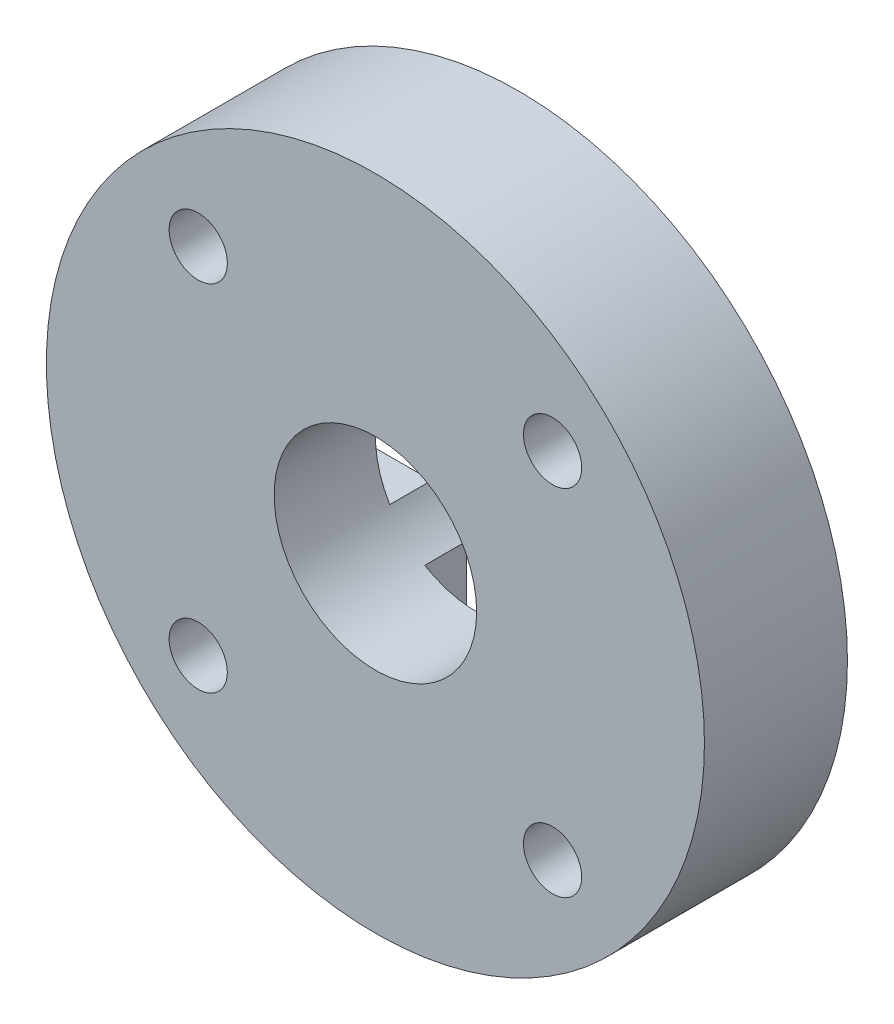
ISO-10303-21;
HEADER;
FILE_DESCRIPTION(('STEP AP214'),'2;1');
FILE_NAME('part.step','',(''),(''),'','','');
FILE_SCHEMA(('AUTOMOTIVE_DESIGN { 1 0 10303 214 1 1 1 1 }'));
ENDSEC;
DATA;
#1=APPLICATION_CONTEXT('core data for automotive mechanical design processes');
#2=APPLICATION_PROTOCOL_DEFINITION('international standard','automotive_design',2000,#1);
#3=PRODUCT_CONTEXT('',#1,'mechanical');
#4=PRODUCT('Part','Part','',(#3));
#5=PRODUCT_RELATED_PRODUCT_CATEGORY('part','',(#4));
#6=PRODUCT_DEFINITION_FORMATION('','',#4);
#7=PRODUCT_DEFINITION_CONTEXT('part definition',#1,'design');
#8=PRODUCT_DEFINITION('design','',#6,#7);
#9=PRODUCT_DEFINITION_SHAPE('','',#8);
#10=(LENGTH_UNIT() NAMED_UNIT(*) SI_UNIT(.MILLI.,.METRE.));
#11=(NAMED_UNIT(*) PLANE_ANGLE_UNIT() SI_UNIT($,.RADIAN.));
#12=(NAMED_UNIT(*) SI_UNIT($,.STERADIAN.) SOLID_ANGLE_UNIT());
#13=UNCERTAINTY_MEASURE_WITH_UNIT(LENGTH_MEASURE(1.E-05),#10,'distance_accuracy_value','');
#14=(GEOMETRIC_REPRESENTATION_CONTEXT(3) GLOBAL_UNCERTAINTY_ASSIGNED_CONTEXT((#13)) GLOBAL_UNIT_ASSIGNED_CONTEXT((#10,
#11,#12)) REPRESENTATION_CONTEXT('',''));
#15=CARTESIAN_POINT('',(0.,0.,0.));
#16=DIRECTION('',(0.,0.,1.));
#17=DIRECTION('',(1.,0.,0.));
#18=AXIS2_PLACEMENT_3D('',#15,#16,#17);
#19=CARTESIAN_POINT('',(0.,0.,-1.65));
#20=DIRECTION('',(0.,0.,1.));
#21=DIRECTION('',(1.,0.,0.));
#22=AXIS2_PLACEMENT_3D('',#19,#20,#21);
#23=PLANE('',#22);
#24=CARTESIAN_POINT('',(7.,-7.,-1.65));
#25=DIRECTION('',(0.,0.,1.));
#26=DIRECTION('',(1.,0.,0.));
#27=AXIS2_PLACEMENT_3D('',#24,#25,#26);
#28=CIRCLE('',#27,1.15);
#29=CARTESIAN_POINT('',(8.15,-7.,-1.65));
#30=VERTEX_POINT('',#29);
#31=EDGE_CURVE('E268',#30,#30,#28,.F.);
#32=ORIENTED_EDGE('',*,*,#31,.F.);
#33=EDGE_LOOP('',(#32));
#34=FACE_BOUND('',#33,.T.);
#35=CARTESIAN_POINT('',(-7.,-7.,-1.65));
#36=DIRECTION('',(0.,0.,1.));
#37=DIRECTION('',(1.,0.,0.));
#38=AXIS2_PLACEMENT_3D('',#35,#36,#37);
#39=CIRCLE('',#38,1.15);
#40=CARTESIAN_POINT('',(-5.85,-7.,-1.65));
#41=VERTEX_POINT('',#40);
#42=EDGE_CURVE('E287',#41,#41,#39,.F.);
#43=ORIENTED_EDGE('',*,*,#42,.F.);
#44=EDGE_LOOP('',(#43));
#45=FACE_BOUND('',#44,.T.);
#46=CARTESIAN_POINT('',(-7.,7.,-1.65));
#47=DIRECTION('',(0.,0.,1.));
#48=DIRECTION('',(1.,0.,0.));
#49=AXIS2_PLACEMENT_3D('',#46,#47,#48);
#50=CIRCLE('',#49,1.15);
#51=CARTESIAN_POINT('',(-5.85,7.,-1.65));
#52=VERTEX_POINT('',#51);
#53=EDGE_CURVE('E291',#52,#52,#50,.F.);
#54=ORIENTED_EDGE('',*,*,#53,.F.);
#55=EDGE_LOOP('',(#54));
#56=FACE_BOUND('',#55,.T.);
#57=CARTESIAN_POINT('',(7.,7.,-1.65));
#58=DIRECTION('',(0.,0.,1.));
#59=DIRECTION('',(1.,0.,0.));
#60=AXIS2_PLACEMENT_3D('',#57,#58,#59);
#61=CIRCLE('',#60,1.15);
#62=CARTESIAN_POINT('',(8.15,7.,-1.65));
#63=VERTEX_POINT('',#62);
#64=EDGE_CURVE('E296',#63,#63,#61,.F.);
#65=ORIENTED_EDGE('',*,*,#64,.F.);
#66=EDGE_LOOP('',(#65));
#67=FACE_BOUND('',#66,.T.);
#68=CARTESIAN_POINT('',(0.,0.,-1.65));
#69=DIRECTION('',(0.,0.,1.));
#70=DIRECTION('',(1.,0.,0.));
#71=AXIS2_PLACEMENT_3D('',#68,#69,#70);
#72=CIRCLE('',#71,13.);
#73=CARTESIAN_POINT('',(13.,0.,-1.65));
#74=VERTEX_POINT('',#73);
#75=EDGE_CURVE('E215',#74,#74,#72,.T.);
#76=ORIENTED_EDGE('',*,*,#75,.F.);
#77=EDGE_LOOP('',(#76));
#78=FACE_BOUND('',#77,.T.);
#79=DIRECTION('',(-1.,0.,0.));
#80=VECTOR('',#79,1.);
#81=CARTESIAN_POINT('',(-8.15,2.05,-1.65));
#82=LINE('',#81,#80);
#83=CARTESIAN_POINT('',(8.15,2.05,-1.65));
#84=VERTEX_POINT('',#83);
#85=CARTESIAN_POINT('',(3.43474889911912,2.05,-1.65));
#86=VERTEX_POINT('',#85);
#87=EDGE_CURVE('E173',#84,#86,#82,.T.);
#88=ORIENTED_EDGE('',*,*,#87,.T.);
#89=CARTESIAN_POINT('',(0.,0.,-1.65));
#90=DIRECTION('',(0.,0.,1.));
#91=DIRECTION('',(1.,0.,0.));
#92=AXIS2_PLACEMENT_3D('',#89,#90,#91);
#93=CIRCLE('',#92,4.);
#94=CARTESIAN_POINT('',(2.05,3.43474889911912,-1.65));
#95=VERTEX_POINT('',#94);
#96=EDGE_CURVE('E154',#86,#95,#93,.T.);
#97=ORIENTED_EDGE('',*,*,#96,.T.);
#98=DIRECTION('',(0.,1.,0.));
#99=VECTOR('',#98,1.);
#100=CARTESIAN_POINT('',(2.05,-8.15,-1.65));
#101=LINE('',#100,#99);
#102=CARTESIAN_POINT('',(2.05,8.15,-1.65));
#103=VERTEX_POINT('',#102);
#104=EDGE_CURVE('E230',#95,#103,#101,.T.);
#105=ORIENTED_EDGE('',*,*,#104,.T.);
#106=CARTESIAN_POINT('',(0.,8.15,-1.65));
#107=DIRECTION('',(0.,0.,1.));
#108=DIRECTION('',(1.,0.,0.));
#109=AXIS2_PLACEMENT_3D('',#106,#107,#108);
#110=CIRCLE('',#109,2.05);
#111=CARTESIAN_POINT('',(-2.05,8.15,-1.65));
#112=VERTEX_POINT('',#111);
#113=EDGE_CURVE('E273',#103,#112,#110,.T.);
#114=ORIENTED_EDGE('',*,*,#113,.T.);
#115=DIRECTION('',(0.,-1.,0.));
#116=VECTOR('',#115,1.);
#117=CARTESIAN_POINT('',(-2.05,-8.15,-1.65));
#118=LINE('',#117,#116);
#119=CARTESIAN_POINT('',(-2.05,3.43474889911912,-1.65));
#120=VERTEX_POINT('',#119);
#121=EDGE_CURVE('E236',#112,#120,#118,.T.);
#122=ORIENTED_EDGE('',*,*,#121,.T.);
#123=CARTESIAN_POINT('',(-3.43474889911912,2.05,-1.65));
#124=VERTEX_POINT('',#123);
#125=EDGE_CURVE('E64',#120,#124,#93,.T.);
#126=ORIENTED_EDGE('',*,*,#125,.T.);
#127=CARTESIAN_POINT('',(-8.15,2.05,-1.65));
#128=VERTEX_POINT('',#127);
#129=EDGE_CURVE('E189',#124,#128,#82,.T.);
#130=ORIENTED_EDGE('',*,*,#129,.T.);
#131=CARTESIAN_POINT('',(-8.15,0.,-1.65));
#132=DIRECTION('',(0.,0.,1.));
#133=DIRECTION('',(1.,0.,0.));
#134=AXIS2_PLACEMENT_3D('',#131,#132,#133);
#135=CIRCLE('',#134,2.05);
#136=CARTESIAN_POINT('',(-8.15,-2.05,-1.65));
#137=VERTEX_POINT('',#136);
#138=EDGE_CURVE('E278',#128,#137,#135,.T.);
#139=ORIENTED_EDGE('',*,*,#138,.T.);
#140=DIRECTION('',(1.,0.,0.));
#141=VECTOR('',#140,1.);
#142=CARTESIAN_POINT('',(-8.15,-2.05,-1.65));
#143=LINE('',#142,#141);
#144=CARTESIAN_POINT('',(-3.43474889911912,-2.05,-1.65));
#145=VERTEX_POINT('',#144);
#146=EDGE_CURVE('E191',#137,#145,#143,.T.);
#147=ORIENTED_EDGE('',*,*,#146,.T.);
#148=CARTESIAN_POINT('',(-2.05,-3.43474889911912,-1.65));
#149=VERTEX_POINT('',#148);
#150=EDGE_CURVE('E636',#145,#149,#93,.T.);
#151=ORIENTED_EDGE('',*,*,#150,.T.);
#152=CARTESIAN_POINT('',(-2.05,-8.15,-1.65));
#153=VERTEX_POINT('',#152);
#154=EDGE_CURVE('E53',#149,#153,#118,.T.);
#155=ORIENTED_EDGE('',*,*,#154,.T.);
#156=CARTESIAN_POINT('',(0.,-8.15,-1.65));
#157=DIRECTION('',(0.,0.,1.));
#158=DIRECTION('',(1.,0.,0.));
#159=AXIS2_PLACEMENT_3D('',#156,#157,#158);
#160=CIRCLE('',#159,2.05);
#161=CARTESIAN_POINT('',(2.05,-8.15,-1.65));
#162=VERTEX_POINT('',#161);
#163=EDGE_CURVE('E270',#153,#162,#160,.T.);
#164=ORIENTED_EDGE('',*,*,#163,.T.);
#165=CARTESIAN_POINT('',(2.05,-3.43474889911912,-1.65));
#166=VERTEX_POINT('',#165);
#167=EDGE_CURVE('E231',#162,#166,#101,.T.);
#168=ORIENTED_EDGE('',*,*,#167,.T.);
#169=CARTESIAN_POINT('',(3.43474889911912,-2.05,-1.65));
#170=VERTEX_POINT('',#169);
#171=EDGE_CURVE('E66',#166,#170,#93,.T.);
#172=ORIENTED_EDGE('',*,*,#171,.T.);
#173=CARTESIAN_POINT('',(8.15,-2.05,-1.65));
#174=VERTEX_POINT('',#173);
#175=EDGE_CURVE('E353',#170,#174,#143,.T.);
#176=ORIENTED_EDGE('',*,*,#175,.T.);
#177=CARTESIAN_POINT('',(8.15,0.,-1.65));
#178=DIRECTION('',(0.,0.,1.));
#179=DIRECTION('',(1.,0.,0.));
#180=AXIS2_PLACEMENT_3D('',#177,#178,#179);
#181=CIRCLE('',#180,2.05);
#182=EDGE_CURVE('E181',#174,#84,#181,.T.);
#183=ORIENTED_EDGE('',*,*,#182,.T.);
#184=EDGE_LOOP('',(#88,#97,#105,#114,#122,#126,#130,#139,#147,#151,#155,#164,#168,#172,#176,#183));
#185=FACE_BOUND('',#184,.T.);
#186=ADVANCED_FACE('F44',(#34,#45,#56,#67,#78,#185),#23,.F.);
#187=CARTESIAN_POINT('',(-8.15,-2.05,0.));
#188=DIRECTION('',(0.,1.,0.));
#189=DIRECTION('',(0.,0.,1.));
#190=AXIS2_PLACEMENT_3D('',#187,#188,#189);
#191=PLANE('',#190);
#192=ORIENTED_EDGE('',*,*,#175,.F.);
#193=DIRECTION('',(0.,0.,-1.));
#194=VECTOR('',#193,1.);
#195=CARTESIAN_POINT('',(3.43474889911912,-2.05,0.));
#196=LINE('',#195,#194);
#197=CARTESIAN_POINT('',(3.43474889911912,-2.05,0.));
#198=VERTEX_POINT('',#197);
#199=EDGE_CURVE('E176',#170,#198,#196,.F.);
#200=ORIENTED_EDGE('',*,*,#199,.T.);
#201=DIRECTION('',(1.,0.,0.));
#202=VECTOR('',#201,1.);
#203=CARTESIAN_POINT('',(-8.15,-2.05,0.));
#204=LINE('',#203,#202);
#205=CARTESIAN_POINT('',(8.15,-2.05,0.));
#206=VERTEX_POINT('',#205);
#207=EDGE_CURVE('E183',#198,#206,#204,.T.);
#208=ORIENTED_EDGE('',*,*,#207,.T.);
#209=DIRECTION('',(0.,0.,-1.));
#210=VECTOR('',#209,1.);
#211=CARTESIAN_POINT('',(8.15,-2.05,0.));
#212=LINE('',#211,#210);
#213=EDGE_CURVE('E204',#206,#174,#212,.T.);
#214=ORIENTED_EDGE('',*,*,#213,.T.);
#215=EDGE_LOOP('',(#192,#200,#208,#214));
#216=FACE_BOUND('',#215,.T.);
#217=ADVANCED_FACE('F409',(#216),#191,.T.);
#218=CARTESIAN_POINT('',(-8.15,2.05,0.));
#219=DIRECTION('',(0.,-1.,0.));
#220=DIRECTION('',(0.,0.,-1.));
#221=AXIS2_PLACEMENT_3D('',#218,#219,#220);
#222=PLANE('',#221);
#223=DIRECTION('',(-1.,0.,0.));
#224=VECTOR('',#223,1.);
#225=CARTESIAN_POINT('',(-8.15,2.05,0.));
#226=LINE('',#225,#224);
#227=CARTESIAN_POINT('',(8.15,2.05,0.));
#228=VERTEX_POINT('',#227);
#229=CARTESIAN_POINT('',(3.43474889911912,2.05,0.));
#230=VERTEX_POINT('',#229);
#231=EDGE_CURVE('E178',#228,#230,#226,.T.);
#232=ORIENTED_EDGE('',*,*,#231,.T.);
#233=DIRECTION('',(0.,0.,-1.));
#234=VECTOR('',#233,1.);
#235=CARTESIAN_POINT('',(3.43474889911912,2.05,0.));
#236=LINE('',#235,#234);
#237=EDGE_CURVE('E159',#230,#86,#236,.T.);
#238=ORIENTED_EDGE('',*,*,#237,.T.);
#239=ORIENTED_EDGE('',*,*,#87,.F.);
#240=DIRECTION('',(0.,0.,-1.));
#241=VECTOR('',#240,1.);
#242=CARTESIAN_POINT('',(8.15,2.05,0.));
#243=LINE('',#242,#241);
#244=EDGE_CURVE('E203',#228,#84,#243,.T.);
#245=ORIENTED_EDGE('',*,*,#244,.F.);
#246=EDGE_LOOP('',(#232,#238,#239,#245));
#247=FACE_BOUND('',#246,.T.);
#248=ADVANCED_FACE('F171',(#247),#222,.T.);
#249=ORIENTED_EDGE('',*,*,#129,.F.);
#250=DIRECTION('',(0.,0.,-1.));
#251=VECTOR('',#250,1.);
#252=CARTESIAN_POINT('',(-3.43474889911912,2.05,0.));
#253=LINE('',#252,#251);
#254=CARTESIAN_POINT('',(-3.43474889911912,2.05,0.));
#255=VERTEX_POINT('',#254);
#256=EDGE_CURVE('E177',#124,#255,#253,.F.);
#257=ORIENTED_EDGE('',*,*,#256,.T.);
#258=CARTESIAN_POINT('',(-8.15,2.05,0.));
#259=VERTEX_POINT('',#258);
#260=EDGE_CURVE('E359',#255,#259,#226,.T.);
#261=ORIENTED_EDGE('',*,*,#260,.T.);
#262=DIRECTION('',(0.,0.,-1.));
#263=VECTOR('',#262,1.);
#264=CARTESIAN_POINT('',(-8.15,2.05,0.));
#265=LINE('',#264,#263);
#266=EDGE_CURVE('E197',#259,#128,#265,.T.);
#267=ORIENTED_EDGE('',*,*,#266,.T.);
#268=EDGE_LOOP('',(#249,#257,#261,#267));
#269=FACE_BOUND('',#268,.T.);
#270=ADVANCED_FACE('F370',(#269),#222,.T.);
#271=CARTESIAN_POINT('',(-8.15,-2.05,0.));
#272=VERTEX_POINT('',#271);
#273=CARTESIAN_POINT('',(-3.43474889911912,-2.05,0.));
#274=VERTEX_POINT('',#273);
#275=EDGE_CURVE('E193',#272,#274,#204,.T.);
#276=ORIENTED_EDGE('',*,*,#275,.T.);
#277=DIRECTION('',(0.,0.,-1.));
#278=VECTOR('',#277,1.);
#279=CARTESIAN_POINT('',(-3.43474889911912,-2.05,0.));
#280=LINE('',#279,#278);
#281=EDGE_CURVE('E321',#274,#145,#280,.T.);
#282=ORIENTED_EDGE('',*,*,#281,.T.);
#283=ORIENTED_EDGE('',*,*,#146,.F.);
#284=DIRECTION('',(0.,0.,-1.));
#285=VECTOR('',#284,1.);
#286=CARTESIAN_POINT('',(-8.15,-2.05,0.));
#287=LINE('',#286,#285);
#288=EDGE_CURVE('E208',#272,#137,#287,.T.);
#289=ORIENTED_EDGE('',*,*,#288,.F.);
#290=EDGE_LOOP('',(#276,#282,#283,#289));
#291=FACE_BOUND('',#290,.T.);
#292=ADVANCED_FACE('F414',(#291),#191,.T.);
#293=CARTESIAN_POINT('',(2.05,-8.15,0.));
#294=DIRECTION('',(-1.,0.,0.));
#295=DIRECTION('',(0.,0.,1.));
#296=AXIS2_PLACEMENT_3D('',#293,#294,#295);
#297=PLANE('',#296);
#298=ORIENTED_EDGE('',*,*,#104,.F.);
#299=DIRECTION('',(0.,0.,-1.));
#300=VECTOR('',#299,1.);
#301=CARTESIAN_POINT('',(2.05,3.43474889911912,0.));
#302=LINE('',#301,#300);
#303=CARTESIAN_POINT('',(2.05,3.43474889911912,0.));
#304=VERTEX_POINT('',#303);
#305=EDGE_CURVE('E165',#95,#304,#302,.F.);
#306=ORIENTED_EDGE('',*,*,#305,.T.);
#307=DIRECTION('',(0.,1.,0.));
#308=VECTOR('',#307,1.);
#309=CARTESIAN_POINT('',(2.05,-8.15,0.));
#310=LINE('',#309,#308);
#311=CARTESIAN_POINT('',(2.05,8.15,0.));
#312=VERTEX_POINT('',#311);
#313=EDGE_CURVE('E257',#304,#312,#310,.T.);
#314=ORIENTED_EDGE('',*,*,#313,.T.);
#315=DIRECTION('',(0.,0.,-1.));
#316=VECTOR('',#315,1.);
#317=CARTESIAN_POINT('',(2.05,8.15,0.));
#318=LINE('',#317,#316);
#319=EDGE_CURVE('E348',#312,#103,#318,.T.);
#320=ORIENTED_EDGE('',*,*,#319,.T.);
#321=EDGE_LOOP('',(#298,#306,#314,#320));
#322=FACE_BOUND('',#321,.T.);
#323=ADVANCED_FACE('F394',(#322),#297,.T.);
#324=CARTESIAN_POINT('',(-2.05,-8.15,0.));
#325=DIRECTION('',(1.,0.,0.));
#326=DIRECTION('',(0.,0.,-1.));
#327=AXIS2_PLACEMENT_3D('',#324,#325,#326);
#328=PLANE('',#327);
#329=DIRECTION('',(0.,-1.,0.));
#330=VECTOR('',#329,1.);
#331=CARTESIAN_POINT('',(-2.05,-8.15,0.));
#332=LINE('',#331,#330);
#333=CARTESIAN_POINT('',(-2.05,8.15,0.));
#334=VERTEX_POINT('',#333);
#335=CARTESIAN_POINT('',(-2.05,3.43474889911912,0.));
#336=VERTEX_POINT('',#335);
#337=EDGE_CURVE('E246',#334,#336,#332,.T.);
#338=ORIENTED_EDGE('',*,*,#337,.T.);
#339=DIRECTION('',(0.,0.,-1.));
#340=VECTOR('',#339,1.);
#341=CARTESIAN_POINT('',(-2.05,3.43474889911912,0.));
#342=LINE('',#341,#340);
#343=EDGE_CURVE('E330',#336,#120,#342,.T.);
#344=ORIENTED_EDGE('',*,*,#343,.T.);
#345=ORIENTED_EDGE('',*,*,#121,.F.);
#346=DIRECTION('',(0.,0.,-1.));
#347=VECTOR('',#346,1.);
#348=CARTESIAN_POINT('',(-2.05,8.15,0.));
#349=LINE('',#348,#347);
#350=EDGE_CURVE('E259',#334,#112,#349,.T.);
#351=ORIENTED_EDGE('',*,*,#350,.F.);
#352=EDGE_LOOP('',(#338,#344,#345,#351));
#353=FACE_BOUND('',#352,.T.);
#354=ADVANCED_FACE('F387',(#353),#328,.T.);
#355=ORIENTED_EDGE('',*,*,#154,.F.);
#356=DIRECTION('',(0.,0.,-1.));
#357=VECTOR('',#356,1.);
#358=CARTESIAN_POINT('',(-2.05,-3.43474889911912,0.));
#359=LINE('',#358,#357);
#360=CARTESIAN_POINT('',(-2.05,-3.43474889911912,0.));
#361=VERTEX_POINT('',#360);
#362=EDGE_CURVE('E170',#149,#361,#359,.F.);
#363=ORIENTED_EDGE('',*,*,#362,.T.);
#364=CARTESIAN_POINT('',(-2.05,-8.15,0.));
#365=VERTEX_POINT('',#364);
#366=EDGE_CURVE('E241',#361,#365,#332,.T.);
#367=ORIENTED_EDGE('',*,*,#366,.T.);
#368=DIRECTION('',(0.,0.,-1.));
#369=VECTOR('',#368,1.);
#370=CARTESIAN_POINT('',(-2.05,-8.15,0.));
#371=LINE('',#370,#369);
#372=EDGE_CURVE('E349',#365,#153,#371,.T.);
#373=ORIENTED_EDGE('',*,*,#372,.T.);
#374=EDGE_LOOP('',(#355,#363,#367,#373));
#375=FACE_BOUND('',#374,.T.);
#376=ADVANCED_FACE('F331',(#375),#328,.T.);
#377=CARTESIAN_POINT('',(2.05,-8.15,0.));
#378=VERTEX_POINT('',#377);
#379=CARTESIAN_POINT('',(2.05,-3.43474889911912,0.));
#380=VERTEX_POINT('',#379);
#381=EDGE_CURVE('E258',#378,#380,#310,.T.);
#382=ORIENTED_EDGE('',*,*,#381,.T.);
#383=DIRECTION('',(0.,0.,-1.));
#384=VECTOR('',#383,1.);
#385=CARTESIAN_POINT('',(2.05,-3.43474889911912,0.));
#386=LINE('',#385,#384);
#387=EDGE_CURVE('E11',#380,#166,#386,.T.);
#388=ORIENTED_EDGE('',*,*,#387,.T.);
#389=ORIENTED_EDGE('',*,*,#167,.F.);
#390=DIRECTION('',(0.,0.,-1.));
#391=VECTOR('',#390,1.);
#392=CARTESIAN_POINT('',(2.05,-8.15,0.));
#393=LINE('',#392,#391);
#394=EDGE_CURVE('E344',#378,#162,#393,.T.);
#395=ORIENTED_EDGE('',*,*,#394,.F.);
#396=EDGE_LOOP('',(#382,#388,#389,#395));
#397=FACE_BOUND('',#396,.T.);
#398=ADVANCED_FACE('F341',(#397),#297,.T.);
#399=CARTESIAN_POINT('',(0.,0.,4.));
#400=DIRECTION('',(0.,0.,1.));
#401=DIRECTION('',(1.,0.,0.));
#402=AXIS2_PLACEMENT_3D('',#399,#400,#401);
#403=PLANE('',#402);
#404=CARTESIAN_POINT('',(7.,-7.,4.));
#405=DIRECTION('',(0.,0.,1.));
#406=DIRECTION('',(1.,0.,0.));
#407=AXIS2_PLACEMENT_3D('',#404,#405,#406);
#408=CIRCLE('',#407,1.15);
#409=CARTESIAN_POINT('',(8.15,-7.,4.));
#410=VERTEX_POINT('',#409);
#411=EDGE_CURVE('E308',#410,#410,#408,.T.);
#412=ORIENTED_EDGE('',*,*,#411,.F.);
#413=EDGE_LOOP('',(#412));
#414=FACE_BOUND('',#413,.T.);
#415=CARTESIAN_POINT('',(-7.,-7.,4.));
#416=DIRECTION('',(0.,0.,1.));
#417=DIRECTION('',(1.,0.,0.));
#418=AXIS2_PLACEMENT_3D('',#415,#416,#417);
#419=CIRCLE('',#418,1.15);
#420=CARTESIAN_POINT('',(-5.85,-7.,4.));
#421=VERTEX_POINT('',#420);
#422=EDGE_CURVE('E309',#421,#421,#419,.T.);
#423=ORIENTED_EDGE('',*,*,#422,.F.);
#424=EDGE_LOOP('',(#423));
#425=FACE_BOUND('',#424,.T.);
#426=CARTESIAN_POINT('',(-7.,7.,4.));
#427=DIRECTION('',(0.,0.,1.));
#428=DIRECTION('',(1.,0.,0.));
#429=AXIS2_PLACEMENT_3D('',#426,#427,#428);
#430=CIRCLE('',#429,1.15);
#431=CARTESIAN_POINT('',(-5.85,7.,4.));
#432=VERTEX_POINT('',#431);
#433=EDGE_CURVE('E304',#432,#432,#430,.T.);
#434=ORIENTED_EDGE('',*,*,#433,.F.);
#435=EDGE_LOOP('',(#434));
#436=FACE_BOUND('',#435,.T.);
#437=CARTESIAN_POINT('',(7.,7.,4.));
#438=DIRECTION('',(0.,0.,1.));
#439=DIRECTION('',(1.,0.,0.));
#440=AXIS2_PLACEMENT_3D('',#437,#438,#439);
#441=CIRCLE('',#440,1.15);
#442=CARTESIAN_POINT('',(8.15,7.,4.));
#443=VERTEX_POINT('',#442);
#444=EDGE_CURVE('E303',#443,#443,#441,.T.);
#445=ORIENTED_EDGE('',*,*,#444,.F.);
#446=EDGE_LOOP('',(#445));
#447=FACE_BOUND('',#446,.T.);
#448=CARTESIAN_POINT('',(0.,0.,4.));
#449=DIRECTION('',(0.,0.,1.));
#450=DIRECTION('',(1.,0.,0.));
#451=AXIS2_PLACEMENT_3D('',#448,#449,#450);
#452=CIRCLE('',#451,13.);
#453=CARTESIAN_POINT('',(13.,0.,4.));
#454=VERTEX_POINT('',#453);
#455=EDGE_CURVE('E225',#454,#454,#452,.T.);
#456=ORIENTED_EDGE('',*,*,#455,.T.);
#457=EDGE_LOOP('',(#456));
#458=FACE_BOUND('',#457,.T.);
#459=CARTESIAN_POINT('',(0.,0.,4.));
#460=DIRECTION('',(0.,0.,1.));
#461=DIRECTION('',(1.,0.,0.));
#462=AXIS2_PLACEMENT_3D('',#459,#460,#461);
#463=CIRCLE('',#462,4.);
#464=CARTESIAN_POINT('',(4.,0.,4.));
#465=VERTEX_POINT('',#464);
#466=EDGE_CURVE('E217',#465,#465,#463,.T.);
#467=ORIENTED_EDGE('',*,*,#466,.F.);
#468=EDGE_LOOP('',(#467));
#469=FACE_BOUND('',#468,.T.);
#470=ADVANCED_FACE('F421',(#414,#425,#436,#447,#458,#469),#403,.T.);
#471=CARTESIAN_POINT('',(0.,0.,4.));
#472=DIRECTION('',(0.,0.,-1.));
#473=DIRECTION('',(-1.,0.,0.));
#474=AXIS2_PLACEMENT_3D('',#471,#472,#473);
#475=CYLINDRICAL_SURFACE('',#474,13.);
#476=ORIENTED_EDGE('',*,*,#455,.F.);
#477=EDGE_LOOP('',(#476));
#478=FACE_BOUND('',#477,.T.);
#479=ORIENTED_EDGE('',*,*,#75,.T.);
#480=EDGE_LOOP('',(#479));
#481=FACE_BOUND('',#480,.T.);
#482=ADVANCED_FACE('F50',(#478,#481),#475,.T.);
#483=CARTESIAN_POINT('',(0.,0.,4.));
#484=DIRECTION('',(0.,0.,-1.));
#485=DIRECTION('',(-1.,0.,0.));
#486=AXIS2_PLACEMENT_3D('',#483,#484,#485);
#487=CYLINDRICAL_SURFACE('',#486,4.);
#488=ORIENTED_EDGE('',*,*,#466,.T.);
#489=EDGE_LOOP('',(#488));
#490=FACE_BOUND('',#489,.T.);
#491=CARTESIAN_POINT('',(0.,0.,0.));
#492=DIRECTION('',(0.,0.,1.));
#493=DIRECTION('',(1.,0.,0.));
#494=AXIS2_PLACEMENT_3D('',#491,#492,#493);
#495=CIRCLE('',#494,4.);
#496=EDGE_CURVE('E224',#304,#336,#495,.T.);
#497=ORIENTED_EDGE('',*,*,#496,.F.);
#498=ORIENTED_EDGE('',*,*,#305,.F.);
#499=ORIENTED_EDGE('',*,*,#96,.F.);
#500=ORIENTED_EDGE('',*,*,#237,.F.);
#501=EDGE_CURVE('E211',#198,#230,#495,.T.);
#502=ORIENTED_EDGE('',*,*,#501,.F.);
#503=ORIENTED_EDGE('',*,*,#199,.F.);
#504=ORIENTED_EDGE('',*,*,#171,.F.);
#505=ORIENTED_EDGE('',*,*,#387,.F.);
#506=EDGE_CURVE('E216',#361,#380,#495,.T.);
#507=ORIENTED_EDGE('',*,*,#506,.F.);
#508=ORIENTED_EDGE('',*,*,#362,.F.);
#509=ORIENTED_EDGE('',*,*,#150,.F.);
#510=ORIENTED_EDGE('',*,*,#281,.F.);
#511=EDGE_CURVE('E220',#255,#274,#495,.T.);
#512=ORIENTED_EDGE('',*,*,#511,.F.);
#513=ORIENTED_EDGE('',*,*,#256,.F.);
#514=ORIENTED_EDGE('',*,*,#125,.F.);
#515=ORIENTED_EDGE('',*,*,#343,.F.);
#516=EDGE_LOOP('',(#497,#498,#499,#500,#502,#503,#504,#505,#507,#508,#509,#510,#512,#513,#514,#515));
#517=FACE_BOUND('',#516,.T.);
#518=ADVANCED_FACE('F158',(#490,#517),#487,.F.);
#519=CARTESIAN_POINT('',(0.,0.,0.));
#520=DIRECTION('',(0.,0.,-1.));
#521=DIRECTION('',(-1.,0.,0.));
#522=AXIS2_PLACEMENT_3D('',#519,#520,#521);
#523=PLANE('',#522);
#524=ORIENTED_EDGE('',*,*,#231,.F.);
#525=CARTESIAN_POINT('',(8.15,0.,0.));
#526=DIRECTION('',(0.,0.,1.));
#527=DIRECTION('',(1.,0.,0.));
#528=AXIS2_PLACEMENT_3D('',#525,#526,#527);
#529=CIRCLE('',#528,2.05);
#530=EDGE_CURVE('E253',#206,#228,#529,.T.);
#531=ORIENTED_EDGE('',*,*,#530,.F.);
#532=ORIENTED_EDGE('',*,*,#207,.F.);
#533=ORIENTED_EDGE('',*,*,#501,.T.);
#534=EDGE_LOOP('',(#524,#531,#532,#533));
#535=FACE_BOUND('',#534,.T.);
#536=ADVANCED_FACE('F423',(#535),#523,.T.);
#537=ORIENTED_EDGE('',*,*,#275,.F.);
#538=CARTESIAN_POINT('',(-8.15,0.,0.));
#539=DIRECTION('',(0.,0.,1.));
#540=DIRECTION('',(1.,0.,0.));
#541=AXIS2_PLACEMENT_3D('',#538,#539,#540);
#542=CIRCLE('',#541,2.05);
#543=EDGE_CURVE('E280',#259,#272,#542,.T.);
#544=ORIENTED_EDGE('',*,*,#543,.F.);
#545=ORIENTED_EDGE('',*,*,#260,.F.);
#546=ORIENTED_EDGE('',*,*,#511,.T.);
#547=EDGE_LOOP('',(#537,#544,#545,#546));
#548=FACE_BOUND('',#547,.T.);
#549=ADVANCED_FACE('F373',(#548),#523,.T.);
#550=CARTESIAN_POINT('',(0.,0.,0.));
#551=DIRECTION('',(0.,0.,-1.));
#552=DIRECTION('',(-1.,0.,0.));
#553=AXIS2_PLACEMENT_3D('',#550,#551,#552);
#554=PLANE('',#553);
#555=ORIENTED_EDGE('',*,*,#337,.F.);
#556=CARTESIAN_POINT('',(0.,8.15,0.));
#557=DIRECTION('',(0.,0.,1.));
#558=DIRECTION('',(1.,0.,0.));
#559=AXIS2_PLACEMENT_3D('',#556,#557,#558);
#560=CIRCLE('',#559,2.05);
#561=EDGE_CURVE('E271',#312,#334,#560,.T.);
#562=ORIENTED_EDGE('',*,*,#561,.F.);
#563=ORIENTED_EDGE('',*,*,#313,.F.);
#564=ORIENTED_EDGE('',*,*,#496,.T.);
#565=EDGE_LOOP('',(#555,#562,#563,#564));
#566=FACE_BOUND('',#565,.T.);
#567=ADVANCED_FACE('F381',(#566),#554,.T.);
#568=ORIENTED_EDGE('',*,*,#381,.F.);
#569=CARTESIAN_POINT('',(0.,-8.15,0.));
#570=DIRECTION('',(0.,0.,1.));
#571=DIRECTION('',(1.,0.,0.));
#572=AXIS2_PLACEMENT_3D('',#569,#570,#571);
#573=CIRCLE('',#572,2.05);
#574=EDGE_CURVE('E262',#365,#378,#573,.T.);
#575=ORIENTED_EDGE('',*,*,#574,.F.);
#576=ORIENTED_EDGE('',*,*,#366,.F.);
#577=ORIENTED_EDGE('',*,*,#506,.T.);
#578=EDGE_LOOP('',(#568,#575,#576,#577));
#579=FACE_BOUND('',#578,.T.);
#580=ADVANCED_FACE('F343',(#579),#554,.T.);
#581=CARTESIAN_POINT('',(0.,-8.15,0.));
#582=DIRECTION('',(0.,0.,-1.));
#583=DIRECTION('',(-1.,0.,0.));
#584=AXIS2_PLACEMENT_3D('',#581,#582,#583);
#585=CYLINDRICAL_SURFACE('',#584,2.05);
#586=ORIENTED_EDGE('',*,*,#163,.F.);
#587=ORIENTED_EDGE('',*,*,#372,.F.);
#588=ORIENTED_EDGE('',*,*,#574,.T.);
#589=ORIENTED_EDGE('',*,*,#394,.T.);
#590=EDGE_LOOP('',(#586,#587,#588,#589));
#591=FACE_BOUND('',#590,.T.);
#592=ADVANCED_FACE('F392',(#591),#585,.F.);
#593=CARTESIAN_POINT('',(0.,8.15,0.));
#594=DIRECTION('',(0.,0.,-1.));
#595=DIRECTION('',(-1.,0.,0.));
#596=AXIS2_PLACEMENT_3D('',#593,#594,#595);
#597=CYLINDRICAL_SURFACE('',#596,2.05);
#598=ORIENTED_EDGE('',*,*,#319,.F.);
#599=ORIENTED_EDGE('',*,*,#561,.T.);
#600=ORIENTED_EDGE('',*,*,#350,.T.);
#601=ORIENTED_EDGE('',*,*,#113,.F.);
#602=EDGE_LOOP('',(#598,#599,#600,#601));
#603=FACE_BOUND('',#602,.T.);
#604=ADVANCED_FACE('F391',(#603),#597,.F.);
#605=CARTESIAN_POINT('',(-8.15,0.,0.));
#606=DIRECTION('',(0.,0.,-1.));
#607=DIRECTION('',(-1.,0.,0.));
#608=AXIS2_PLACEMENT_3D('',#605,#606,#607);
#609=CYLINDRICAL_SURFACE('',#608,2.05);
#610=ORIENTED_EDGE('',*,*,#543,.T.);
#611=ORIENTED_EDGE('',*,*,#288,.T.);
#612=ORIENTED_EDGE('',*,*,#138,.F.);
#613=ORIENTED_EDGE('',*,*,#266,.F.);
#614=EDGE_LOOP('',(#610,#611,#612,#613));
#615=FACE_BOUND('',#614,.T.);
#616=ADVANCED_FACE('F393',(#615),#609,.F.);
#617=CARTESIAN_POINT('',(8.15,0.,0.));
#618=DIRECTION('',(0.,0.,-1.));
#619=DIRECTION('',(-1.,0.,0.));
#620=AXIS2_PLACEMENT_3D('',#617,#618,#619);
#621=CYLINDRICAL_SURFACE('',#620,2.05);
#622=ORIENTED_EDGE('',*,*,#182,.F.);
#623=ORIENTED_EDGE('',*,*,#213,.F.);
#624=ORIENTED_EDGE('',*,*,#530,.T.);
#625=ORIENTED_EDGE('',*,*,#244,.T.);
#626=EDGE_LOOP('',(#622,#623,#624,#625));
#627=FACE_BOUND('',#626,.T.);
#628=ADVANCED_FACE('F402',(#627),#621,.F.);
#629=CARTESIAN_POINT('',(7.,7.,4.));
#630=DIRECTION('',(0.,0.,-1.));
#631=DIRECTION('',(-1.,0.,0.));
#632=AXIS2_PLACEMENT_3D('',#629,#630,#631);
#633=CYLINDRICAL_SURFACE('',#632,1.15);
#634=ORIENTED_EDGE('',*,*,#444,.T.);
#635=EDGE_LOOP('',(#634));
#636=FACE_BOUND('',#635,.T.);
#637=ORIENTED_EDGE('',*,*,#64,.T.);
#638=EDGE_LOOP('',(#637));
#639=FACE_BOUND('',#638,.T.);
#640=ADVANCED_FACE('F441',(#636,#639),#633,.F.);
#641=CARTESIAN_POINT('',(-7.,7.,4.));
#642=DIRECTION('',(0.,0.,-1.));
#643=DIRECTION('',(-1.,0.,0.));
#644=AXIS2_PLACEMENT_3D('',#641,#642,#643);
#645=CYLINDRICAL_SURFACE('',#644,1.15);
#646=ORIENTED_EDGE('',*,*,#433,.T.);
#647=EDGE_LOOP('',(#646));
#648=FACE_BOUND('',#647,.T.);
#649=ORIENTED_EDGE('',*,*,#53,.T.);
#650=EDGE_LOOP('',(#649));
#651=FACE_BOUND('',#650,.T.);
#652=ADVANCED_FACE('F449',(#648,#651),#645,.F.);
#653=CARTESIAN_POINT('',(-7.,-7.,4.));
#654=DIRECTION('',(0.,0.,-1.));
#655=DIRECTION('',(-1.,0.,0.));
#656=AXIS2_PLACEMENT_3D('',#653,#654,#655);
#657=CYLINDRICAL_SURFACE('',#656,1.15);
#658=ORIENTED_EDGE('',*,*,#422,.T.);
#659=EDGE_LOOP('',(#658));
#660=FACE_BOUND('',#659,.T.);
#661=ORIENTED_EDGE('',*,*,#42,.T.);
#662=EDGE_LOOP('',(#661));
#663=FACE_BOUND('',#662,.T.);
#664=ADVANCED_FACE('F457',(#660,#663),#657,.F.);
#665=CARTESIAN_POINT('',(7.,-7.,4.));
#666=DIRECTION('',(0.,0.,-1.));
#667=DIRECTION('',(-1.,0.,0.));
#668=AXIS2_PLACEMENT_3D('',#665,#666,#667);
#669=CYLINDRICAL_SURFACE('',#668,1.15);
#670=ORIENTED_EDGE('',*,*,#411,.T.);
#671=EDGE_LOOP('',(#670));
#672=FACE_BOUND('',#671,.T.);
#673=ORIENTED_EDGE('',*,*,#31,.T.);
#674=EDGE_LOOP('',(#673));
#675=FACE_BOUND('',#674,.T.);
#676=ADVANCED_FACE('F461',(#672,#675),#669,.F.);
#677=CLOSED_SHELL('',(#186,#217,#248,#270,#292,#323,#354,#376,#398,#470,#482,#518,#536,#549,
#567,#580,#592,#604,#616,#628,#640,#652,#664,#676));
#678=MANIFOLD_SOLID_BREP('B2',#677);
#679=ADVANCED_BREP_SHAPE_REPRESENTATION('',(#18,#678),#14);
#680=SHAPE_DEFINITION_REPRESENTATION(#9,#679);
ENDSEC;
END-ISO-10303-21;
